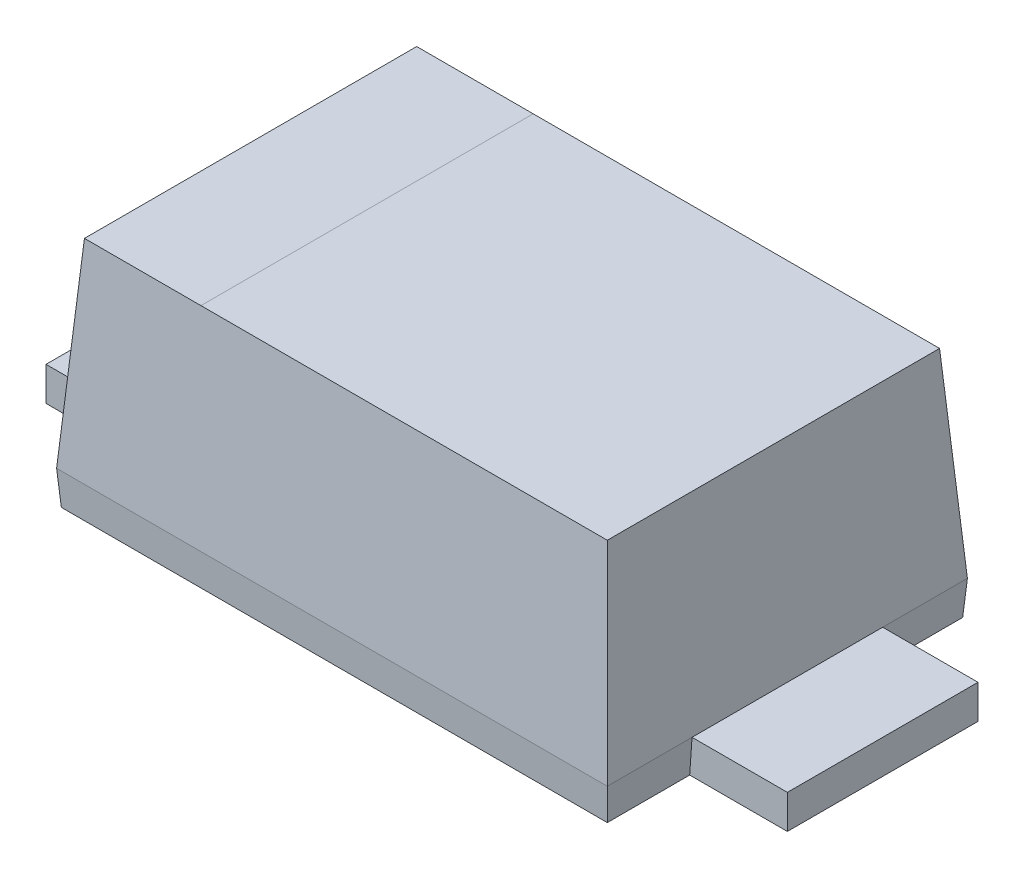
ISO-10303-21;
HEADER;
FILE_DESCRIPTION(('STEP AP214'),'2;1');
FILE_NAME('part.step','',(''),(''),'','','');
FILE_SCHEMA(('AUTOMOTIVE_DESIGN { 1 0 10303 214 1 1 1 1 }'));
ENDSEC;
DATA;
#1=APPLICATION_CONTEXT('core data for automotive mechanical design processes');
#2=APPLICATION_PROTOCOL_DEFINITION('international standard','automotive_design',2000,#1);
#3=PRODUCT_CONTEXT('',#1,'mechanical');
#4=PRODUCT('Part','Part','',(#3));
#5=PRODUCT_RELATED_PRODUCT_CATEGORY('part','',(#4));
#6=PRODUCT_DEFINITION_FORMATION('','',#4);
#7=PRODUCT_DEFINITION_CONTEXT('part definition',#1,'design');
#8=PRODUCT_DEFINITION('design','',#6,#7);
#9=PRODUCT_DEFINITION_SHAPE('','',#8);
#10=(LENGTH_UNIT() NAMED_UNIT(*) SI_UNIT(.MILLI.,.METRE.));
#11=(NAMED_UNIT(*) PLANE_ANGLE_UNIT() SI_UNIT($,.RADIAN.));
#12=(NAMED_UNIT(*) SI_UNIT($,.STERADIAN.) SOLID_ANGLE_UNIT());
#13=UNCERTAINTY_MEASURE_WITH_UNIT(LENGTH_MEASURE(1.E-05),#10,'distance_accuracy_value','');
#14=(GEOMETRIC_REPRESENTATION_CONTEXT(3) GLOBAL_UNCERTAINTY_ASSIGNED_CONTEXT((#13)) GLOBAL_UNIT_ASSIGNED_CONTEXT((#10,
#11,#12)) REPRESENTATION_CONTEXT('',''));
#15=CARTESIAN_POINT('',(0.,0.,0.));
#16=DIRECTION('',(0.,0.,1.));
#17=DIRECTION('',(1.,0.,0.));
#18=AXIS2_PLACEMENT_3D('',#15,#16,#17);
#19=CARTESIAN_POINT('',(-1.3,0.16,0.45));
#20=DIRECTION('',(0.,-1.,0.));
#21=DIRECTION('',(1.,0.,0.));
#22=AXIS2_PLACEMENT_3D('',#19,#20,#21);
#23=PLANE('',#22);
#24=DIRECTION('',(0.,0.,-1.));
#25=VECTOR('',#24,1.);
#26=CARTESIAN_POINT('',(-1.75,0.16,0.45));
#27=LINE('',#26,#25);
#28=CARTESIAN_POINT('',(-1.75,0.16,-0.45));
#29=VERTEX_POINT('',#28);
#30=CARTESIAN_POINT('',(-1.75,0.16,0.45));
#31=VERTEX_POINT('',#30);
#32=EDGE_CURVE('P0_E20',#29,#31,#27,.F.);
#33=ORIENTED_EDGE('',*,*,#32,.T.);
#34=DIRECTION('',(1.,0.,0.));
#35=VECTOR('',#34,1.);
#36=CARTESIAN_POINT('',(0.,0.16,0.45));
#37=LINE('',#36,#35);
#38=CARTESIAN_POINT('',(-1.3,0.16,0.45));
#39=VERTEX_POINT('',#38);
#40=EDGE_CURVE('P0_E55',#39,#31,#37,.F.);
#41=ORIENTED_EDGE('',*,*,#40,.F.);
#42=DIRECTION('',(0.,0.,1.));
#43=VECTOR('',#42,1.);
#44=CARTESIAN_POINT('',(-1.3,0.16,0.45));
#45=LINE('',#44,#43);
#46=CARTESIAN_POINT('',(-1.3,0.16,-0.45));
#47=VERTEX_POINT('',#46);
#48=EDGE_CURVE('P0_E74',#39,#47,#45,.F.);
#49=ORIENTED_EDGE('',*,*,#48,.T.);
#50=DIRECTION('',(1.,0.,0.));
#51=VECTOR('',#50,1.);
#52=CARTESIAN_POINT('',(0.,0.16,-0.45));
#53=LINE('',#52,#51);
#54=EDGE_CURVE('P0_E66',#47,#29,#53,.F.);
#55=ORIENTED_EDGE('',*,*,#54,.T.);
#56=EDGE_LOOP('',(#33,#41,#49,#55));
#57=FACE_BOUND('',#56,.T.);
#58=ADVANCED_FACE('P0_F17',(#57),#23,.F.);
#59=CARTESIAN_POINT('',(-1.75,0.16,0.45));
#60=DIRECTION('',(1.,0.,0.));
#61=DIRECTION('',(0.,0.,-1.));
#62=AXIS2_PLACEMENT_3D('',#59,#60,#61);
#63=PLANE('',#62);
#64=DIRECTION('',(0.,0.,1.));
#65=VECTOR('',#64,1.);
#66=CARTESIAN_POINT('',(-1.75,0.,0.45));
#67=LINE('',#66,#65);
#68=CARTESIAN_POINT('',(-1.75,0.,-0.45));
#69=VERTEX_POINT('',#68);
#70=CARTESIAN_POINT('',(-1.75,0.,0.45));
#71=VERTEX_POINT('',#70);
#72=EDGE_CURVE('P0_E72',#69,#71,#67,.T.);
#73=ORIENTED_EDGE('',*,*,#72,.T.);
#74=DIRECTION('',(0.,1.,0.));
#75=VECTOR('',#74,1.);
#76=CARTESIAN_POINT('',(-1.75,0.,0.45));
#77=LINE('',#76,#75);
#78=EDGE_CURVE('P0_E62',#31,#71,#77,.F.);
#79=ORIENTED_EDGE('',*,*,#78,.F.);
#80=ORIENTED_EDGE('',*,*,#32,.F.);
#81=DIRECTION('',(0.,1.,0.));
#82=VECTOR('',#81,1.);
#83=CARTESIAN_POINT('',(-1.75,0.,-0.45));
#84=LINE('',#83,#82);
#85=EDGE_CURVE('P0_E79',#29,#69,#84,.F.);
#86=ORIENTED_EDGE('',*,*,#85,.T.);
#87=EDGE_LOOP('',(#73,#79,#80,#86));
#88=FACE_BOUND('',#87,.T.);
#89=ADVANCED_FACE('P0_F71',(#88),#63,.F.);
#90=CARTESIAN_POINT('',(0.,0.,0.45));
#91=DIRECTION('',(0.,0.,1.));
#92=DIRECTION('',(1.,0.,0.));
#93=AXIS2_PLACEMENT_3D('',#90,#91,#92);
#94=PLANE('',#93);
#95=ORIENTED_EDGE('',*,*,#78,.T.);
#96=DIRECTION('',(-1.,0.,0.));
#97=VECTOR('',#96,1.);
#98=CARTESIAN_POINT('',(-1.75,0.,0.45));
#99=LINE('',#98,#97);
#100=CARTESIAN_POINT('',(-1.28881171008904,0.,0.45));
#101=VERTEX_POINT('',#100);
#102=EDGE_CURVE('P0_E83',#71,#101,#99,.F.);
#103=ORIENTED_EDGE('',*,*,#102,.T.);
#104=DIRECTION('',(0.0697564737441453,-0.997564050259823,0.));
#105=VECTOR('',#104,1.);
#106=CARTESIAN_POINT('',(-1.28881171008904,0.,0.45));
#107=LINE('',#106,#105);
#108=EDGE_CURVE('P0_E64',#101,#39,#107,.F.);
#109=ORIENTED_EDGE('',*,*,#108,.T.);
#110=ORIENTED_EDGE('',*,*,#40,.T.);
#111=EDGE_LOOP('',(#95,#103,#109,#110));
#112=FACE_BOUND('',#111,.T.);
#113=ADVANCED_FACE('P0_F59',(#112),#94,.T.);
#114=CARTESIAN_POINT('',(-1.28881171008904,0.,0.45));
#115=DIRECTION('',(-0.997564050259823,-0.0697564737441453,0.));
#116=DIRECTION('',(0.0697564737441453,-0.997564050259823,0.));
#117=AXIS2_PLACEMENT_3D('',#114,#115,#116);
#118=PLANE('',#117);
#119=ORIENTED_EDGE('',*,*,#48,.F.);
#120=ORIENTED_EDGE('',*,*,#108,.F.);
#121=DIRECTION('',(0.,0.,1.));
#122=VECTOR('',#121,1.);
#123=CARTESIAN_POINT('',(-1.28881171008904,0.,0.45));
#124=LINE('',#123,#122);
#125=CARTESIAN_POINT('',(-1.28881171008904,0.,-0.45));
#126=VERTEX_POINT('',#125);
#127=EDGE_CURVE('P0_E26',#101,#126,#124,.F.);
#128=ORIENTED_EDGE('',*,*,#127,.T.);
#129=DIRECTION('',(-0.0697564737441157,0.997564050259825,0.));
#130=VECTOR('',#129,1.);
#131=CARTESIAN_POINT('',(-1.28881171008904,0.,-0.45));
#132=LINE('',#131,#130);
#133=EDGE_CURVE('P0_E34',#126,#47,#132,.T.);
#134=ORIENTED_EDGE('',*,*,#133,.T.);
#135=EDGE_LOOP('',(#119,#120,#128,#134));
#136=FACE_BOUND('',#135,.T.);
#137=ADVANCED_FACE('P0_F88',(#136),#118,.F.);
#138=CARTESIAN_POINT('',(0.,0.,-0.45));
#139=DIRECTION('',(0.,0.,1.));
#140=DIRECTION('',(1.,0.,0.));
#141=AXIS2_PLACEMENT_3D('',#138,#139,#140);
#142=PLANE('',#141);
#143=DIRECTION('',(-1.,0.,0.));
#144=VECTOR('',#143,1.);
#145=CARTESIAN_POINT('',(-1.75,0.,-0.45));
#146=LINE('',#145,#144);
#147=EDGE_CURVE('P0_E11',#126,#69,#146,.T.);
#148=ORIENTED_EDGE('',*,*,#147,.T.);
#149=ORIENTED_EDGE('',*,*,#85,.F.);
#150=ORIENTED_EDGE('',*,*,#54,.F.);
#151=ORIENTED_EDGE('',*,*,#133,.F.);
#152=EDGE_LOOP('',(#148,#149,#150,#151));
#153=FACE_BOUND('',#152,.T.);
#154=ADVANCED_FACE('P0_F91',(#153),#142,.F.);
#155=CARTESIAN_POINT('',(-1.75,0.,0.45));
#156=DIRECTION('',(0.,1.,0.));
#157=DIRECTION('',(-1.,0.,0.));
#158=AXIS2_PLACEMENT_3D('',#155,#156,#157);
#159=PLANE('',#158);
#160=ORIENTED_EDGE('',*,*,#127,.F.);
#161=ORIENTED_EDGE('',*,*,#102,.F.);
#162=ORIENTED_EDGE('',*,*,#72,.F.);
#163=ORIENTED_EDGE('',*,*,#147,.F.);
#164=EDGE_LOOP('',(#160,#161,#162,#163));
#165=FACE_BOUND('',#164,.T.);
#166=ADVANCED_FACE('P0_F90',(#165),#159,.F.);
#167=CLOSED_SHELL('',(#58,#89,#113,#137,#154,#166));
#168=MANIFOLD_SOLID_BREP('P0_B1',#167);
#169=CARTESIAN_POINT('',(1.3,0.16,0.45));
#170=DIRECTION('',(0.,-1.,0.));
#171=DIRECTION('',(1.,0.,0.));
#172=AXIS2_PLACEMENT_3D('',#169,#170,#171);
#173=PLANE('',#172);
#174=DIRECTION('',(0.,0.,1.));
#175=VECTOR('',#174,1.);
#176=CARTESIAN_POINT('',(1.3,0.16,0.45));
#177=LINE('',#176,#175);
#178=CARTESIAN_POINT('',(1.3,0.16,-0.45));
#179=VERTEX_POINT('',#178);
#180=CARTESIAN_POINT('',(1.3,0.16,0.45));
#181=VERTEX_POINT('',#180);
#182=EDGE_CURVE('P1_E20',#179,#181,#177,.T.);
#183=ORIENTED_EDGE('',*,*,#182,.T.);
#184=DIRECTION('',(1.,0.,0.));
#185=VECTOR('',#184,1.);
#186=CARTESIAN_POINT('',(0.,0.16,0.45));
#187=LINE('',#186,#185);
#188=CARTESIAN_POINT('',(1.75,0.16,0.45));
#189=VERTEX_POINT('',#188);
#190=EDGE_CURVE('P1_E55',#189,#181,#187,.F.);
#191=ORIENTED_EDGE('',*,*,#190,.F.);
#192=DIRECTION('',(0.,0.,1.));
#193=VECTOR('',#192,1.);
#194=CARTESIAN_POINT('',(1.75,0.16,0.45));
#195=LINE('',#194,#193);
#196=CARTESIAN_POINT('',(1.75,0.16,-0.45));
#197=VERTEX_POINT('',#196);
#198=EDGE_CURVE('P1_E74',#189,#197,#195,.F.);
#199=ORIENTED_EDGE('',*,*,#198,.T.);
#200=DIRECTION('',(1.,0.,0.));
#201=VECTOR('',#200,1.);
#202=CARTESIAN_POINT('',(0.,0.16,-0.45));
#203=LINE('',#202,#201);
#204=EDGE_CURVE('P1_E66',#197,#179,#203,.F.);
#205=ORIENTED_EDGE('',*,*,#204,.T.);
#206=EDGE_LOOP('',(#183,#191,#199,#205));
#207=FACE_BOUND('',#206,.T.);
#208=ADVANCED_FACE('P1_F17',(#207),#173,.F.);
#209=CARTESIAN_POINT('',(1.28881171008904,0.,0.45));
#210=DIRECTION('',(0.997564050259823,-0.0697564737441453,0.));
#211=DIRECTION('',(0.0697564737441453,0.997564050259823,0.));
#212=AXIS2_PLACEMENT_3D('',#209,#210,#211);
#213=PLANE('',#212);
#214=DIRECTION('',(0.,0.,1.));
#215=VECTOR('',#214,1.);
#216=CARTESIAN_POINT('',(1.28881171008904,0.,0.45));
#217=LINE('',#216,#215);
#218=CARTESIAN_POINT('',(1.28881171008904,0.,-0.45));
#219=VERTEX_POINT('',#218);
#220=CARTESIAN_POINT('',(1.28881171008904,0.,0.45));
#221=VERTEX_POINT('',#220);
#222=EDGE_CURVE('P1_E72',#219,#221,#217,.T.);
#223=ORIENTED_EDGE('',*,*,#222,.T.);
#224=DIRECTION('',(-0.0697564737441157,-0.997564050259825,0.));
#225=VECTOR('',#224,1.);
#226=CARTESIAN_POINT('',(1.3,0.16,0.45));
#227=LINE('',#226,#225);
#228=EDGE_CURVE('P1_E62',#181,#221,#227,.T.);
#229=ORIENTED_EDGE('',*,*,#228,.F.);
#230=ORIENTED_EDGE('',*,*,#182,.F.);
#231=DIRECTION('',(-0.0697564737441157,-0.997564050259825,0.));
#232=VECTOR('',#231,1.);
#233=CARTESIAN_POINT('',(1.3,0.16,-0.45));
#234=LINE('',#233,#232);
#235=EDGE_CURVE('P1_E80',#179,#219,#234,.T.);
#236=ORIENTED_EDGE('',*,*,#235,.T.);
#237=EDGE_LOOP('',(#223,#229,#230,#236));
#238=FACE_BOUND('',#237,.T.);
#239=ADVANCED_FACE('P1_F71',(#238),#213,.F.);
#240=CARTESIAN_POINT('',(0.,0.,0.45));
#241=DIRECTION('',(0.,0.,1.));
#242=DIRECTION('',(1.,0.,0.));
#243=AXIS2_PLACEMENT_3D('',#240,#241,#242);
#244=PLANE('',#243);
#245=ORIENTED_EDGE('',*,*,#190,.T.);
#246=ORIENTED_EDGE('',*,*,#228,.T.);
#247=DIRECTION('',(-1.,0.,0.));
#248=VECTOR('',#247,1.);
#249=CARTESIAN_POINT('',(1.75,0.,0.45));
#250=LINE('',#249,#248);
#251=CARTESIAN_POINT('',(1.75,0.,0.45));
#252=VERTEX_POINT('',#251);
#253=EDGE_CURVE('P1_E83',#221,#252,#250,.F.);
#254=ORIENTED_EDGE('',*,*,#253,.T.);
#255=DIRECTION('',(0.,1.,0.));
#256=VECTOR('',#255,1.);
#257=CARTESIAN_POINT('',(1.75,0.16,0.45));
#258=LINE('',#257,#256);
#259=EDGE_CURVE('P1_E64',#252,#189,#258,.T.);
#260=ORIENTED_EDGE('',*,*,#259,.T.);
#261=EDGE_LOOP('',(#245,#246,#254,#260));
#262=FACE_BOUND('',#261,.T.);
#263=ADVANCED_FACE('P1_F59',(#262),#244,.T.);
#264=CARTESIAN_POINT('',(1.75,0.16,0.45));
#265=DIRECTION('',(-1.,0.,0.));
#266=DIRECTION('',(0.,0.,1.));
#267=AXIS2_PLACEMENT_3D('',#264,#265,#266);
#268=PLANE('',#267);
#269=ORIENTED_EDGE('',*,*,#198,.F.);
#270=ORIENTED_EDGE('',*,*,#259,.F.);
#271=DIRECTION('',(0.,0.,1.));
#272=VECTOR('',#271,1.);
#273=CARTESIAN_POINT('',(1.75,0.,0.45));
#274=LINE('',#273,#272);
#275=CARTESIAN_POINT('',(1.75,0.,-0.45));
#276=VERTEX_POINT('',#275);
#277=EDGE_CURVE('P1_E26',#252,#276,#274,.F.);
#278=ORIENTED_EDGE('',*,*,#277,.T.);
#279=DIRECTION('',(0.,1.,0.));
#280=VECTOR('',#279,1.);
#281=CARTESIAN_POINT('',(1.75,0.,-0.45));
#282=LINE('',#281,#280);
#283=EDGE_CURVE('P1_E34',#276,#197,#282,.T.);
#284=ORIENTED_EDGE('',*,*,#283,.T.);
#285=EDGE_LOOP('',(#269,#270,#278,#284));
#286=FACE_BOUND('',#285,.T.);
#287=ADVANCED_FACE('P1_F88',(#286),#268,.F.);
#288=CARTESIAN_POINT('',(0.,0.,-0.45));
#289=DIRECTION('',(0.,0.,1.));
#290=DIRECTION('',(1.,0.,0.));
#291=AXIS2_PLACEMENT_3D('',#288,#289,#290);
#292=PLANE('',#291);
#293=ORIENTED_EDGE('',*,*,#235,.F.);
#294=ORIENTED_EDGE('',*,*,#204,.F.);
#295=ORIENTED_EDGE('',*,*,#283,.F.);
#296=DIRECTION('',(-1.,0.,0.));
#297=VECTOR('',#296,1.);
#298=CARTESIAN_POINT('',(1.75,0.,-0.45));
#299=LINE('',#298,#297);
#300=EDGE_CURVE('P1_E11',#276,#219,#299,.T.);
#301=ORIENTED_EDGE('',*,*,#300,.T.);
#302=EDGE_LOOP('',(#293,#294,#295,#301));
#303=FACE_BOUND('',#302,.T.);
#304=ADVANCED_FACE('P1_F91',(#303),#292,.F.);
#305=CARTESIAN_POINT('',(1.75,0.,0.45));
#306=DIRECTION('',(0.,1.,0.));
#307=DIRECTION('',(-1.,0.,0.));
#308=AXIS2_PLACEMENT_3D('',#305,#306,#307);
#309=PLANE('',#308);
#310=ORIENTED_EDGE('',*,*,#277,.F.);
#311=ORIENTED_EDGE('',*,*,#253,.F.);
#312=ORIENTED_EDGE('',*,*,#222,.F.);
#313=ORIENTED_EDGE('',*,*,#300,.F.);
#314=EDGE_LOOP('',(#310,#311,#312,#313));
#315=FACE_BOUND('',#314,.T.);
#316=ADVANCED_FACE('P1_F90',(#315),#309,.F.);
#317=CLOSED_SHELL('',(#208,#239,#263,#287,#304,#316));
#318=MANIFOLD_SOLID_BREP('P1_B1',#317);
#319=CARTESIAN_POINT('',(0.,1.05,0.));
#320=DIRECTION('',(0.,1.,0.));
#321=DIRECTION('',(0.,0.,1.));
#322=AXIS2_PLACEMENT_3D('',#319,#320,#321);
#323=PLANE('',#322);
#324=DIRECTION('',(0.,0.,-1.));
#325=VECTOR('',#324,1.);
#326=CARTESIAN_POINT('',(-0.6842687967731,1.05,-0.7842687967731));
#327=LINE('',#326,#325);
#328=CARTESIAN_POINT('',(-0.6842687967731,1.05,0.7842687967731));
#329=VERTEX_POINT('',#328);
#330=CARTESIAN_POINT('',(-0.6842687967731,1.05,-0.7842687967731));
#331=VERTEX_POINT('',#330);
#332=EDGE_CURVE('P2_E85',#329,#331,#327,.T.);
#333=ORIENTED_EDGE('',*,*,#332,.T.);
#334=DIRECTION('',(-1.,0.,0.));
#335=VECTOR('',#334,1.);
#336=CARTESIAN_POINT('',(-1.2342687967731,1.05,-0.7842687967731));
#337=LINE('',#336,#335);
#338=CARTESIAN_POINT('',(-1.2342687967731,1.05,-0.7842687967731));
#339=VERTEX_POINT('',#338);
#340=EDGE_CURVE('P2_E107',#331,#339,#337,.T.);
#341=ORIENTED_EDGE('',*,*,#340,.T.);
#342=DIRECTION('',(0.,0.,1.));
#343=VECTOR('',#342,1.);
#344=CARTESIAN_POINT('',(-1.2342687967731,1.05,-0.7842687967731));
#345=LINE('',#344,#343);
#346=CARTESIAN_POINT('',(-1.2342687967731,1.05,0.7842687967731));
#347=VERTEX_POINT('',#346);
#348=EDGE_CURVE('P2_E89',#339,#347,#345,.T.);
#349=ORIENTED_EDGE('',*,*,#348,.T.);
#350=DIRECTION('',(1.,0.,0.));
#351=VECTOR('',#350,1.);
#352=CARTESIAN_POINT('',(0.,1.05,0.7842687967731));
#353=LINE('',#352,#351);
#354=EDGE_CURVE('P2_E20',#347,#329,#353,.T.);
#355=ORIENTED_EDGE('',*,*,#354,.T.);
#356=EDGE_LOOP('',(#333,#341,#349,#355));
#357=FACE_BOUND('',#356,.T.);
#358=ADVANCED_FACE('P2_F17',(#357),#323,.T.);
#359=CARTESIAN_POINT('',(-0.6842687967731,1.05,-0.7842687967731));
#360=DIRECTION('',(1.,0.,0.));
#361=DIRECTION('',(0.,0.,-1.));
#362=AXIS2_PLACEMENT_3D('',#359,#360,#361);
#363=PLANE('',#362);
#364=DIRECTION('',(0.,1.,0.));
#365=VECTOR('',#364,1.);
#366=CARTESIAN_POINT('',(-0.6842687967731,1.05,-0.7842687967731));
#367=LINE('',#366,#365);
#368=CARTESIAN_POINT('',(-0.6842687967731,1.1,-0.7842687967731));
#369=VERTEX_POINT('',#368);
#370=EDGE_CURVE('P2_E99',#369,#331,#367,.F.);
#371=ORIENTED_EDGE('',*,*,#370,.T.);
#372=ORIENTED_EDGE('',*,*,#332,.F.);
#373=DIRECTION('',(0.,1.,0.));
#374=VECTOR('',#373,1.);
#375=CARTESIAN_POINT('',(-0.6842687967731,1.05,0.7842687967731));
#376=LINE('',#375,#374);
#377=CARTESIAN_POINT('',(-0.6842687967731,1.1,0.7842687967731));
#378=VERTEX_POINT('',#377);
#379=EDGE_CURVE('P2_E93',#378,#329,#376,.F.);
#380=ORIENTED_EDGE('',*,*,#379,.F.);
#381=DIRECTION('',(0.,0.,-1.));
#382=VECTOR('',#381,1.);
#383=CARTESIAN_POINT('',(-0.6842687967731,1.1,0.85));
#384=LINE('',#383,#382);
#385=EDGE_CURVE('P2_E113',#378,#369,#384,.T.);
#386=ORIENTED_EDGE('',*,*,#385,.T.);
#387=EDGE_LOOP('',(#371,#372,#380,#386));
#388=FACE_BOUND('',#387,.T.);
#389=ADVANCED_FACE('P2_F96',(#388),#363,.F.);
#390=CARTESIAN_POINT('',(-1.2342687967731,1.05,-0.7842687967731));
#391=DIRECTION('',(0.,0.,-1.));
#392=DIRECTION('',(-1.,0.,0.));
#393=AXIS2_PLACEMENT_3D('',#390,#391,#392);
#394=PLANE('',#393);
#395=DIRECTION('',(0.,1.,0.));
#396=VECTOR('',#395,1.);
#397=CARTESIAN_POINT('',(-1.2342687967731,1.05,-0.7842687967731));
#398=LINE('',#397,#396);
#399=CARTESIAN_POINT('',(-1.2342687967731,1.1,-0.7842687967731));
#400=VERTEX_POINT('',#399);
#401=EDGE_CURVE('P2_E109',#400,#339,#398,.F.);
#402=ORIENTED_EDGE('',*,*,#401,.T.);
#403=ORIENTED_EDGE('',*,*,#340,.F.);
#404=ORIENTED_EDGE('',*,*,#370,.F.);
#405=DIRECTION('',(1.,0.,0.));
#406=VECTOR('',#405,1.);
#407=CARTESIAN_POINT('',(-1.3,1.1,-0.7842687967731));
#408=LINE('',#407,#406);
#409=EDGE_CURVE('P2_E125',#369,#400,#408,.F.);
#410=ORIENTED_EDGE('',*,*,#409,.T.);
#411=EDGE_LOOP('',(#402,#403,#404,#410));
#412=FACE_BOUND('',#411,.T.);
#413=ADVANCED_FACE('P2_F225',(#412),#394,.F.);
#414=CARTESIAN_POINT('',(-1.2342687967731,1.05,-0.7842687967731));
#415=DIRECTION('',(-1.,0.,0.));
#416=DIRECTION('',(0.,0.,1.));
#417=AXIS2_PLACEMENT_3D('',#414,#415,#416);
#418=PLANE('',#417);
#419=DIRECTION('',(0.,1.,0.));
#420=VECTOR('',#419,1.);
#421=CARTESIAN_POINT('',(-1.2342687967731,1.05,0.7842687967731));
#422=LINE('',#421,#420);
#423=CARTESIAN_POINT('',(-1.2342687967731,1.1,0.7842687967731));
#424=VERTEX_POINT('',#423);
#425=EDGE_CURVE('P2_E115',#424,#347,#422,.F.);
#426=ORIENTED_EDGE('',*,*,#425,.T.);
#427=ORIENTED_EDGE('',*,*,#348,.F.);
#428=ORIENTED_EDGE('',*,*,#401,.F.);
#429=DIRECTION('',(0.,0.,1.));
#430=VECTOR('',#429,1.);
#431=CARTESIAN_POINT('',(-1.2342687967731,1.1,0.85));
#432=LINE('',#431,#430);
#433=EDGE_CURVE('P2_E128',#400,#424,#432,.T.);
#434=ORIENTED_EDGE('',*,*,#433,.T.);
#435=EDGE_LOOP('',(#426,#427,#428,#434));
#436=FACE_BOUND('',#435,.T.);
#437=ADVANCED_FACE('P2_F221',(#436),#418,.F.);
#438=CARTESIAN_POINT('',(-1.3,1.1,0.85));
#439=DIRECTION('',(0.,-1.,0.));
#440=DIRECTION('',(0.,0.,-1.));
#441=AXIS2_PLACEMENT_3D('',#438,#439,#440);
#442=PLANE('',#441);
#443=ORIENTED_EDGE('',*,*,#385,.F.);
#444=DIRECTION('',(1.,0.,0.));
#445=VECTOR('',#444,1.);
#446=CARTESIAN_POINT('',(0.,1.1,0.7842687967731));
#447=LINE('',#446,#445);
#448=CARTESIAN_POINT('',(1.2342687967731,1.1,0.7842687967731));
#449=VERTEX_POINT('',#448);
#450=EDGE_CURVE('P2_E139',#449,#378,#447,.F.);
#451=ORIENTED_EDGE('',*,*,#450,.F.);
#452=DIRECTION('',(0.,0.,1.));
#453=VECTOR('',#452,1.);
#454=CARTESIAN_POINT('',(1.2342687967731,1.1,0.85));
#455=LINE('',#454,#453);
#456=CARTESIAN_POINT('',(1.2342687967731,1.1,-0.784268796773101));
#457=VERTEX_POINT('',#456);
#458=EDGE_CURVE('P2_E117',#449,#457,#455,.F.);
#459=ORIENTED_EDGE('',*,*,#458,.T.);
#460=DIRECTION('',(1.,0.,0.));
#461=VECTOR('',#460,1.);
#462=CARTESIAN_POINT('',(-1.3,1.1,-0.7842687967731));
#463=LINE('',#462,#461);
#464=EDGE_CURVE('P2_E122',#457,#369,#463,.F.);
#465=ORIENTED_EDGE('',*,*,#464,.T.);
#466=EDGE_LOOP('',(#443,#451,#459,#465));
#467=FACE_BOUND('',#466,.T.);
#468=ADVANCED_FACE('P2_F218',(#467),#442,.F.);
#469=CARTESIAN_POINT('',(-1.2342687967731,1.05,0.7842687967731));
#470=DIRECTION('',(0.,0.,1.));
#471=DIRECTION('',(1.,0.,0.));
#472=AXIS2_PLACEMENT_3D('',#469,#470,#471);
#473=PLANE('',#472);
#474=ORIENTED_EDGE('',*,*,#379,.T.);
#475=ORIENTED_EDGE('',*,*,#354,.F.);
#476=ORIENTED_EDGE('',*,*,#425,.F.);
#477=DIRECTION('',(1.,0.,0.));
#478=VECTOR('',#477,1.);
#479=CARTESIAN_POINT('',(0.,1.1,0.7842687967731));
#480=LINE('',#479,#478);
#481=EDGE_CURVE('P2_E104',#378,#424,#480,.F.);
#482=ORIENTED_EDGE('',*,*,#481,.F.);
#483=EDGE_LOOP('',(#474,#475,#476,#482));
#484=FACE_BOUND('',#483,.T.);
#485=ADVANCED_FACE('P2_F102',(#484),#473,.F.);
#486=CARTESIAN_POINT('',(1.2342687967731,1.1,0.85));
#487=DIRECTION('',(-0.997564050259825,-0.0697564737441222,0.));
#488=DIRECTION('',(0.0697564737441222,-0.997564050259825,0.));
#489=AXIS2_PLACEMENT_3D('',#486,#487,#488);
#490=PLANE('',#489);
#491=DIRECTION('',(0.,0.,1.));
#492=VECTOR('',#491,1.);
#493=CARTESIAN_POINT('',(1.3,0.159999999999955,0.85));
#494=LINE('',#493,#492);
#495=CARTESIAN_POINT('',(1.3,0.159999999999955,0.85));
#496=VERTEX_POINT('',#495);
#497=CARTESIAN_POINT('',(1.3,0.159999999999954,-0.85));
#498=VERTEX_POINT('',#497);
#499=EDGE_CURVE('P2_E143',#496,#498,#494,.F.);
#500=ORIENTED_EDGE('',*,*,#499,.T.);
#501=DIRECTION('',(-0.0695873743166615,0.995145815783509,0.0695873743166614));
#502=VECTOR('',#501,1.);
#503=CARTESIAN_POINT('',(1.3,0.159999999999954,-0.85));
#504=LINE('',#503,#502);
#505=EDGE_CURVE('P2_E119',#498,#457,#504,.T.);
#506=ORIENTED_EDGE('',*,*,#505,.T.);
#507=ORIENTED_EDGE('',*,*,#458,.F.);
#508=DIRECTION('',(-0.0695873743166616,0.995145815783509,-0.0695873743166615));
#509=VECTOR('',#508,1.);
#510=CARTESIAN_POINT('',(1.3,0.159999999999955,0.85));
#511=LINE('',#510,#509);
#512=EDGE_CURVE('P2_E136',#496,#449,#511,.T.);
#513=ORIENTED_EDGE('',*,*,#512,.F.);
#514=EDGE_LOOP('',(#500,#506,#507,#513));
#515=FACE_BOUND('',#514,.T.);
#516=ADVANCED_FACE('P2_F211',(#515),#490,.F.);
#517=CARTESIAN_POINT('',(-1.3,1.1,-0.7842687967731));
#518=DIRECTION('',(0.,-0.069756473744122,0.997564050259825));
#519=DIRECTION('',(0.,-0.997564050259825,-0.069756473744122));
#520=AXIS2_PLACEMENT_3D('',#517,#518,#519);
#521=PLANE('',#520);
#522=ORIENTED_EDGE('',*,*,#409,.F.);
#523=ORIENTED_EDGE('',*,*,#464,.F.);
#524=ORIENTED_EDGE('',*,*,#505,.F.);
#525=DIRECTION('',(1.,0.,0.));
#526=VECTOR('',#525,1.);
#527=CARTESIAN_POINT('',(-1.3,0.159999999999954,-0.849999999999996));
#528=LINE('',#527,#526);
#529=CARTESIAN_POINT('',(-1.3,0.159999999999954,-0.849999999999999));
#530=VERTEX_POINT('',#529);
#531=EDGE_CURVE('P2_E146',#498,#530,#528,.F.);
#532=ORIENTED_EDGE('',*,*,#531,.T.);
#533=DIRECTION('',(0.0695873743166615,0.995145815783509,0.0695873743166613));
#534=VECTOR('',#533,1.);
#535=CARTESIAN_POINT('',(-1.3,0.159999999999954,-0.850000000000001));
#536=LINE('',#535,#534);
#537=EDGE_CURVE('P2_E131',#530,#400,#536,.T.);
#538=ORIENTED_EDGE('',*,*,#537,.T.);
#539=EDGE_LOOP('',(#522,#523,#524,#532,#538));
#540=FACE_BOUND('',#539,.T.);
#541=ADVANCED_FACE('P2_F207',(#540),#521,.F.);
#542=CARTESIAN_POINT('',(-1.3,0.159999999999955,0.85));
#543=DIRECTION('',(0.997564050259825,-0.0697564737441222,0.));
#544=DIRECTION('',(0.0697564737441222,0.997564050259825,0.));
#545=AXIS2_PLACEMENT_3D('',#542,#543,#544);
#546=PLANE('',#545);
#547=DIRECTION('',(0.,0.,1.));
#548=VECTOR('',#547,1.);
#549=CARTESIAN_POINT('',(-1.3,0.159999999999954,0.85));
#550=LINE('',#549,#548);
#551=CARTESIAN_POINT('',(-1.3,0.159999999999955,0.849999999999999));
#552=VERTEX_POINT('',#551);
#553=EDGE_CURVE('P2_E155',#530,#552,#550,.T.);
#554=ORIENTED_EDGE('',*,*,#553,.T.);
#555=DIRECTION('',(-0.0695873743166616,-0.995145815783509,0.0695873743166615));
#556=VECTOR('',#555,1.);
#557=CARTESIAN_POINT('',(-1.2342687967731,1.1,0.7842687967731));
#558=LINE('',#557,#556);
#559=EDGE_CURVE('P2_E134',#424,#552,#558,.T.);
#560=ORIENTED_EDGE('',*,*,#559,.F.);
#561=ORIENTED_EDGE('',*,*,#433,.F.);
#562=ORIENTED_EDGE('',*,*,#537,.F.);
#563=EDGE_LOOP('',(#554,#560,#561,#562));
#564=FACE_BOUND('',#563,.T.);
#565=ADVANCED_FACE('P2_F203',(#564),#546,.F.);
#566=CARTESIAN_POINT('',(0.,0.159999999999955,0.85));
#567=DIRECTION('',(0.,0.0697564737441221,0.997564050259825));
#568=DIRECTION('',(0.,-0.997564050259825,0.0697564737441221));
#569=AXIS2_PLACEMENT_3D('',#566,#567,#568);
#570=PLANE('',#569);
#571=ORIENTED_EDGE('',*,*,#450,.T.);
#572=ORIENTED_EDGE('',*,*,#481,.T.);
#573=ORIENTED_EDGE('',*,*,#559,.T.);
#574=DIRECTION('',(1.,0.,0.));
#575=VECTOR('',#574,1.);
#576=CARTESIAN_POINT('',(0.,0.159999999999955,0.849999999999996));
#577=LINE('',#576,#575);
#578=EDGE_CURVE('P2_E161',#496,#552,#577,.F.);
#579=ORIENTED_EDGE('',*,*,#578,.F.);
#580=ORIENTED_EDGE('',*,*,#512,.T.);
#581=EDGE_LOOP('',(#571,#572,#573,#579,#580));
#582=FACE_BOUND('',#581,.T.);
#583=ADVANCED_FACE('P2_F200',(#582),#570,.T.);
#584=CARTESIAN_POINT('',(1.3,0.160000000000009,0.85));
#585=DIRECTION('',(-0.997564050259825,0.0697564737441214,0.));
#586=DIRECTION('',(-0.0697564737441214,-0.997564050259825,0.));
#587=AXIS2_PLACEMENT_3D('',#584,#585,#586);
#588=PLANE('',#587);
#589=ORIENTED_EDGE('',*,*,#499,.F.);
#590=DIRECTION('',(0.0695873743166745,0.995145815783508,0.069587374316661));
#591=VECTOR('',#590,1.);
#592=CARTESIAN_POINT('',(1.28881171008904,0.,0.838811710089038));
#593=LINE('',#592,#591);
#594=CARTESIAN_POINT('',(1.28881171008904,0.,0.838811710089038));
#595=VERTEX_POINT('',#594);
#596=EDGE_CURVE('P2_E158',#595,#496,#593,.T.);
#597=ORIENTED_EDGE('',*,*,#596,.F.);
#598=DIRECTION('',(0.,0.,1.));
#599=VECTOR('',#598,1.);
#600=CARTESIAN_POINT('',(1.28881171008904,0.,0.85));
#601=LINE('',#600,#599);
#602=CARTESIAN_POINT('',(1.28881171008904,0.,-0.838811710089038));
#603=VERTEX_POINT('',#602);
#604=EDGE_CURVE('P2_E164',#595,#603,#601,.F.);
#605=ORIENTED_EDGE('',*,*,#604,.T.);
#606=DIRECTION('',(0.0695873743166736,0.995145815783508,-0.0695873743166621));
#607=VECTOR('',#606,1.);
#608=CARTESIAN_POINT('',(1.28881171008904,0.,-0.838811710089038));
#609=LINE('',#608,#607);
#610=EDGE_CURVE('P2_E149',#603,#498,#609,.T.);
#611=ORIENTED_EDGE('',*,*,#610,.T.);
#612=EDGE_LOOP('',(#589,#597,#605,#611));
#613=FACE_BOUND('',#612,.T.);
#614=ADVANCED_FACE('P2_F182',(#613),#588,.F.);
#615=CARTESIAN_POINT('',(-1.3,0.,-0.838811710089038));
#616=DIRECTION('',(0.,0.0697564737441227,0.997564050259825));
#617=DIRECTION('',(0.,-0.997564050259825,0.0697564737441227));
#618=AXIS2_PLACEMENT_3D('',#615,#616,#617);
#619=PLANE('',#618);
#620=DIRECTION('',(1.,0.,0.));
#621=VECTOR('',#620,1.);
#622=CARTESIAN_POINT('',(-1.3,0.,-0.838811710089038));
#623=LINE('',#622,#621);
#624=CARTESIAN_POINT('',(-1.28881171008904,0.,-0.838811710089038));
#625=VERTEX_POINT('',#624);
#626=EDGE_CURVE('P2_E167',#603,#625,#623,.F.);
#627=ORIENTED_EDGE('',*,*,#626,.T.);
#628=DIRECTION('',(-0.0695873743166601,0.995145815783507,-0.0695873743166857));
#629=VECTOR('',#628,1.);
#630=CARTESIAN_POINT('',(-1.28881171008904,0.,-0.838811710089038));
#631=LINE('',#630,#629);
#632=EDGE_CURVE('P2_E152',#625,#530,#631,.T.);
#633=ORIENTED_EDGE('',*,*,#632,.T.);
#634=ORIENTED_EDGE('',*,*,#531,.F.);
#635=ORIENTED_EDGE('',*,*,#610,.F.);
#636=EDGE_LOOP('',(#627,#633,#634,#635));
#637=FACE_BOUND('',#636,.T.);
#638=ADVANCED_FACE('P2_F179',(#637),#619,.F.);
#639=CARTESIAN_POINT('',(-1.28881171008904,0.,0.85));
#640=DIRECTION('',(0.997564050259825,0.0697564737441214,0.));
#641=DIRECTION('',(-0.0697564737441214,0.997564050259825,0.));
#642=AXIS2_PLACEMENT_3D('',#639,#640,#641);
#643=PLANE('',#642);
#644=ORIENTED_EDGE('',*,*,#553,.F.);
#645=ORIENTED_EDGE('',*,*,#632,.F.);
#646=DIRECTION('',(0.,0.,1.));
#647=VECTOR('',#646,1.);
#648=CARTESIAN_POINT('',(-1.28881171008904,0.,0.85));
#649=LINE('',#648,#647);
#650=CARTESIAN_POINT('',(-1.28881171008904,0.,0.838811710089038));
#651=VERTEX_POINT('',#650);
#652=EDGE_CURVE('P2_E26',#625,#651,#649,.T.);
#653=ORIENTED_EDGE('',*,*,#652,.T.);
#654=DIRECTION('',(0.0695873743166745,-0.995145815783508,-0.069587374316661));
#655=VECTOR('',#654,1.);
#656=CARTESIAN_POINT('',(-1.3,0.159999999999955,0.849999999999996));
#657=LINE('',#656,#655);
#658=EDGE_CURVE('P2_E34',#552,#651,#657,.T.);
#659=ORIENTED_EDGE('',*,*,#658,.F.);
#660=EDGE_LOOP('',(#644,#645,#653,#659));
#661=FACE_BOUND('',#660,.T.);
#662=ADVANCED_FACE('P2_F174',(#661),#643,.F.);
#663=CARTESIAN_POINT('',(0.,0.160000000000009,0.85));
#664=DIRECTION('',(0.,-0.0697564737441221,0.997564050259825));
#665=DIRECTION('',(0.,-0.997564050259825,-0.0697564737441221));
#666=AXIS2_PLACEMENT_3D('',#663,#664,#665);
#667=PLANE('',#666);
#668=ORIENTED_EDGE('',*,*,#658,.T.);
#669=DIRECTION('',(1.,0.,0.));
#670=VECTOR('',#669,1.);
#671=CARTESIAN_POINT('',(-1.3,0.,0.838811710089038));
#672=LINE('',#671,#670);
#673=EDGE_CURVE('P2_E11',#651,#595,#672,.T.);
#674=ORIENTED_EDGE('',*,*,#673,.T.);
#675=ORIENTED_EDGE('',*,*,#596,.T.);
#676=ORIENTED_EDGE('',*,*,#578,.T.);
#677=EDGE_LOOP('',(#668,#674,#675,#676));
#678=FACE_BOUND('',#677,.T.);
#679=ADVANCED_FACE('P2_F185',(#678),#667,.T.);
#680=CARTESIAN_POINT('',(-1.3,0.,0.85));
#681=DIRECTION('',(0.,1.,0.));
#682=DIRECTION('',(0.,0.,1.));
#683=AXIS2_PLACEMENT_3D('',#680,#681,#682);
#684=PLANE('',#683);
#685=ORIENTED_EDGE('',*,*,#652,.F.);
#686=ORIENTED_EDGE('',*,*,#626,.F.);
#687=ORIENTED_EDGE('',*,*,#604,.F.);
#688=ORIENTED_EDGE('',*,*,#673,.F.);
#689=EDGE_LOOP('',(#685,#686,#687,#688));
#690=FACE_BOUND('',#689,.T.);
#691=ADVANCED_FACE('P2_F177',(#690),#684,.F.);
#692=CLOSED_SHELL('',(#358,#389,#413,#437,#468,#485,#516,#541,#565,#583,#614,#638,#662,#679,#691));
#693=MANIFOLD_SOLID_BREP('P2_B1',#692);
#694=CARTESIAN_POINT('',(0.,1.05,0.));
#695=DIRECTION('',(0.,1.,0.));
#696=DIRECTION('',(0.,0.,1.));
#697=AXIS2_PLACEMENT_3D('',#694,#695,#696);
#698=PLANE('',#697);
#699=DIRECTION('',(1.,0.,0.));
#700=VECTOR('',#699,1.);
#701=CARTESIAN_POINT('',(0.,1.05,-0.7842687967731));
#702=LINE('',#701,#700);
#703=CARTESIAN_POINT('',(-0.6842687967731,1.05,-0.7842687967731));
#704=VERTEX_POINT('',#703);
#705=CARTESIAN_POINT('',(-1.2342687967731,1.05,-0.7842687967731));
#706=VERTEX_POINT('',#705);
#707=EDGE_CURVE('P3_E20',#704,#706,#702,.F.);
#708=ORIENTED_EDGE('',*,*,#707,.F.);
#709=DIRECTION('',(0.,0.,-1.));
#710=VECTOR('',#709,1.);
#711=CARTESIAN_POINT('',(-0.6842687967731,1.05,-0.7842687967731));
#712=LINE('',#711,#710);
#713=CARTESIAN_POINT('',(-0.6842687967731,1.05,0.7842687967731));
#714=VERTEX_POINT('',#713);
#715=EDGE_CURVE('P3_E55',#714,#704,#712,.T.);
#716=ORIENTED_EDGE('',*,*,#715,.F.);
#717=DIRECTION('',(1.,0.,0.));
#718=VECTOR('',#717,1.);
#719=CARTESIAN_POINT('',(-1.2342687967731,1.05,0.7842687967731));
#720=LINE('',#719,#718);
#721=CARTESIAN_POINT('',(-1.2342687967731,1.05,0.7842687967731));
#722=VERTEX_POINT('',#721);
#723=EDGE_CURVE('P3_E58',#722,#714,#720,.T.);
#724=ORIENTED_EDGE('',*,*,#723,.F.);
#725=DIRECTION('',(0.,0.,1.));
#726=VECTOR('',#725,1.);
#727=CARTESIAN_POINT('',(-1.2342687967731,1.05,-0.7842687967731));
#728=LINE('',#727,#726);
#729=EDGE_CURVE('P3_E60',#706,#722,#728,.T.);
#730=ORIENTED_EDGE('',*,*,#729,.F.);
#731=EDGE_LOOP('',(#708,#716,#724,#730));
#732=FACE_BOUND('',#731,.T.);
#733=ADVANCED_FACE('P3_F17',(#732),#698,.F.);
#734=CARTESIAN_POINT('',(-1.2342687967731,-0.612170322911495,-0.7842687967731));
#735=DIRECTION('',(-1.,0.,0.));
#736=DIRECTION('',(0.,0.,1.));
#737=AXIS2_PLACEMENT_3D('',#734,#735,#736);
#738=PLANE('',#737);
#739=DIRECTION('',(0.,0.,1.));
#740=VECTOR('',#739,1.);
#741=CARTESIAN_POINT('',(-1.2342687967731,1.1,0.));
#742=LINE('',#741,#740);
#743=CARTESIAN_POINT('',(-1.2342687967731,1.1,-0.7842687967731));
#744=VERTEX_POINT('',#743);
#745=CARTESIAN_POINT('',(-1.2342687967731,1.1,0.7842687967731));
#746=VERTEX_POINT('',#745);
#747=EDGE_CURVE('P3_E83',#744,#746,#742,.T.);
#748=ORIENTED_EDGE('',*,*,#747,.F.);
#749=DIRECTION('',(0.,1.,0.));
#750=VECTOR('',#749,1.);
#751=CARTESIAN_POINT('',(-1.2342687967731,-0.612170322911495,-0.7842687967731));
#752=LINE('',#751,#750);
#753=EDGE_CURVE('P3_E71',#706,#744,#752,.T.);
#754=ORIENTED_EDGE('',*,*,#753,.F.);
#755=ORIENTED_EDGE('',*,*,#729,.T.);
#756=DIRECTION('',(0.,1.,0.));
#757=VECTOR('',#756,1.);
#758=CARTESIAN_POINT('',(-1.2342687967731,-0.612170322911495,0.7842687967731));
#759=LINE('',#758,#757);
#760=EDGE_CURVE('P3_E65',#746,#722,#759,.F.);
#761=ORIENTED_EDGE('',*,*,#760,.F.);
#762=EDGE_LOOP('',(#748,#754,#755,#761));
#763=FACE_BOUND('',#762,.T.);
#764=ADVANCED_FACE('P3_F68',(#763),#738,.T.);
#765=CARTESIAN_POINT('',(-1.2342687967731,-0.612170322911495,0.7842687967731));
#766=DIRECTION('',(0.,0.,1.));
#767=DIRECTION('',(1.,0.,0.));
#768=AXIS2_PLACEMENT_3D('',#765,#766,#767);
#769=PLANE('',#768);
#770=DIRECTION('',(1.,0.,0.));
#771=VECTOR('',#770,1.);
#772=CARTESIAN_POINT('',(0.,1.1,0.7842687967731));
#773=LINE('',#772,#771);
#774=CARTESIAN_POINT('',(-0.6842687967731,1.1,0.7842687967731));
#775=VERTEX_POINT('',#774);
#776=EDGE_CURVE('P3_E74',#746,#775,#773,.T.);
#777=ORIENTED_EDGE('',*,*,#776,.F.);
#778=ORIENTED_EDGE('',*,*,#760,.T.);
#779=ORIENTED_EDGE('',*,*,#723,.T.);
#780=DIRECTION('',(0.,1.,0.));
#781=VECTOR('',#780,1.);
#782=CARTESIAN_POINT('',(-0.6842687967731,-0.612170322911495,0.7842687967731));
#783=LINE('',#782,#781);
#784=EDGE_CURVE('P3_E77',#775,#714,#783,.F.);
#785=ORIENTED_EDGE('',*,*,#784,.F.);
#786=EDGE_LOOP('',(#777,#778,#779,#785));
#787=FACE_BOUND('',#786,.T.);
#788=ADVANCED_FACE('P3_F72',(#787),#769,.T.);
#789=CARTESIAN_POINT('',(-0.6842687967731,-0.612170322911495,-0.7842687967731));
#790=DIRECTION('',(1.,0.,0.));
#791=DIRECTION('',(0.,0.,-1.));
#792=AXIS2_PLACEMENT_3D('',#789,#790,#791);
#793=PLANE('',#792);
#794=DIRECTION('',(0.,0.,1.));
#795=VECTOR('',#794,1.);
#796=CARTESIAN_POINT('',(-0.6842687967731,1.1,0.));
#797=LINE('',#796,#795);
#798=CARTESIAN_POINT('',(-0.6842687967731,1.1,-0.7842687967731));
#799=VERTEX_POINT('',#798);
#800=EDGE_CURVE('P3_E26',#775,#799,#797,.F.);
#801=ORIENTED_EDGE('',*,*,#800,.F.);
#802=ORIENTED_EDGE('',*,*,#784,.T.);
#803=ORIENTED_EDGE('',*,*,#715,.T.);
#804=DIRECTION('',(0.,1.,0.));
#805=VECTOR('',#804,1.);
#806=CARTESIAN_POINT('',(-0.6842687967731,-0.612170322911495,-0.7842687967731));
#807=LINE('',#806,#805);
#808=EDGE_CURVE('P3_E35',#799,#704,#807,.F.);
#809=ORIENTED_EDGE('',*,*,#808,.F.);
#810=EDGE_LOOP('',(#801,#802,#803,#809));
#811=FACE_BOUND('',#810,.T.);
#812=ADVANCED_FACE('P3_F89',(#811),#793,.T.);
#813=CARTESIAN_POINT('',(-1.2342687967731,-0.612170322911495,-0.7842687967731));
#814=DIRECTION('',(0.,0.,-1.));
#815=DIRECTION('',(-1.,0.,0.));
#816=AXIS2_PLACEMENT_3D('',#813,#814,#815);
#817=PLANE('',#816);
#818=DIRECTION('',(1.,0.,0.));
#819=VECTOR('',#818,1.);
#820=CARTESIAN_POINT('',(0.,1.1,-0.7842687967731));
#821=LINE('',#820,#819);
#822=EDGE_CURVE('P3_E11',#799,#744,#821,.F.);
#823=ORIENTED_EDGE('',*,*,#822,.F.);
#824=ORIENTED_EDGE('',*,*,#808,.T.);
#825=ORIENTED_EDGE('',*,*,#707,.T.);
#826=ORIENTED_EDGE('',*,*,#753,.T.);
#827=EDGE_LOOP('',(#823,#824,#825,#826));
#828=FACE_BOUND('',#827,.T.);
#829=ADVANCED_FACE('P3_F91',(#828),#817,.T.);
#830=CARTESIAN_POINT('',(0.,1.1,0.));
#831=DIRECTION('',(0.,1.,0.));
#832=DIRECTION('',(0.,0.,1.));
#833=AXIS2_PLACEMENT_3D('',#830,#831,#832);
#834=PLANE('',#833);
#835=ORIENTED_EDGE('',*,*,#800,.T.);
#836=ORIENTED_EDGE('',*,*,#822,.T.);
#837=ORIENTED_EDGE('',*,*,#747,.T.);
#838=ORIENTED_EDGE('',*,*,#776,.T.);
#839=EDGE_LOOP('',(#835,#836,#837,#838));
#840=FACE_BOUND('',#839,.T.);
#841=ADVANCED_FACE('P3_F88',(#840),#834,.T.);
#842=CLOSED_SHELL('',(#733,#764,#788,#812,#829,#841));
#843=MANIFOLD_SOLID_BREP('P3_B1',#842);
#844=ADVANCED_BREP_SHAPE_REPRESENTATION('',(#18,#168,#318,#693,#843),#14);
#845=SHAPE_DEFINITION_REPRESENTATION(#9,#844);
ENDSEC;
END-ISO-10303-21;
